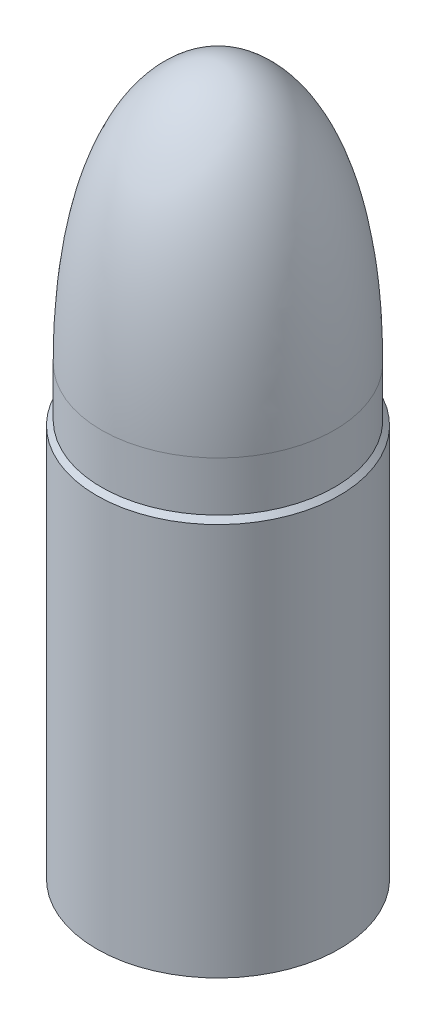
ISO-10303-21;
HEADER;
FILE_DESCRIPTION(('STEP AP214'),'2;1');
FILE_NAME('part.step','',(''),(''),'','','');
FILE_SCHEMA(('AUTOMOTIVE_DESIGN { 1 0 10303 214 1 1 1 1 }'));
ENDSEC;
DATA;
#1=APPLICATION_CONTEXT('core data for automotive mechanical design processes');
#2=APPLICATION_PROTOCOL_DEFINITION('international standard','automotive_design',2000,#1);
#3=PRODUCT_CONTEXT('',#1,'mechanical');
#4=PRODUCT('Part','Part','',(#3));
#5=PRODUCT_RELATED_PRODUCT_CATEGORY('part','',(#4));
#6=PRODUCT_DEFINITION_FORMATION('','',#4);
#7=PRODUCT_DEFINITION_CONTEXT('part definition',#1,'design');
#8=PRODUCT_DEFINITION('design','',#6,#7);
#9=PRODUCT_DEFINITION_SHAPE('','',#8);
#10=(LENGTH_UNIT() NAMED_UNIT(*) SI_UNIT(.MILLI.,.METRE.));
#11=(NAMED_UNIT(*) PLANE_ANGLE_UNIT() SI_UNIT($,.RADIAN.));
#12=(NAMED_UNIT(*) SI_UNIT($,.STERADIAN.) SOLID_ANGLE_UNIT());
#13=UNCERTAINTY_MEASURE_WITH_UNIT(LENGTH_MEASURE(1.E-05),#10,'distance_accuracy_value','');
#14=(GEOMETRIC_REPRESENTATION_CONTEXT(3) GLOBAL_UNCERTAINTY_ASSIGNED_CONTEXT((#13)) GLOBAL_UNIT_ASSIGNED_CONTEXT((#10,
#11,#12)) REPRESENTATION_CONTEXT('',''));
#15=CARTESIAN_POINT('',(0.,0.,0.));
#16=DIRECTION('',(0.,0.,1.));
#17=DIRECTION('',(1.,0.,0.));
#18=AXIS2_PLACEMENT_3D('',#15,#16,#17);
#19=CARTESIAN_POINT('',(0.,5.,0.));
#20=DIRECTION('',(0.,-1.,0.));
#21=DIRECTION('',(0.,0.,-1.));
#22=AXIS2_PLACEMENT_3D('',#19,#20,#21);
#23=CYLINDRICAL_SURFACE('',#22,38.);
#24=CARTESIAN_POINT('',(0.,2.99999999999996,0.));
#25=DIRECTION('',(0.,-1.,0.));
#26=DIRECTION('',(0.,0.,-1.));
#27=AXIS2_PLACEMENT_3D('',#24,#25,#26);
#28=CIRCLE('',#27,38.);
#29=CARTESIAN_POINT('',(0.,2.99999999999996,-38.));
#30=VERTEX_POINT('',#29);
#31=EDGE_CURVE('E51',#30,#30,#28,.T.);
#32=ORIENTED_EDGE('',*,*,#31,.T.);
#33=EDGE_LOOP('',(#32));
#34=FACE_BOUND('',#33,.T.);
#35=CARTESIAN_POINT('',(0.,-120.,0.));
#36=DIRECTION('',(0.,-1.,0.));
#37=DIRECTION('',(0.,0.,-1.));
#38=AXIS2_PLACEMENT_3D('',#35,#36,#37);
#39=CIRCLE('',#38,38.);
#40=CARTESIAN_POINT('',(0.,-120.,-38.));
#41=VERTEX_POINT('',#40);
#42=EDGE_CURVE('E69',#41,#41,#39,.T.);
#43=ORIENTED_EDGE('',*,*,#42,.F.);
#44=EDGE_LOOP('',(#43));
#45=FACE_BOUND('',#44,.T.);
#46=ADVANCED_FACE('F41',(#34,#45),#23,.T.);
#47=CARTESIAN_POINT('',(0.,-120.,0.));
#48=DIRECTION('',(0.,-1.,0.));
#49=DIRECTION('',(0.,0.,-1.));
#50=AXIS2_PLACEMENT_3D('',#47,#48,#49);
#51=PLANE('',#50);
#52=CARTESIAN_POINT('',(0.,-120.,0.));
#53=DIRECTION('',(0.,-1.,0.));
#54=DIRECTION('',(0.,0.,-1.));
#55=AXIS2_PLACEMENT_3D('',#52,#53,#54);
#56=CIRCLE('',#55,37.15);
#57=CARTESIAN_POINT('',(0.,-120.,-37.15));
#58=VERTEX_POINT('',#57);
#59=EDGE_CURVE('E128',#58,#58,#56,.T.);
#60=ORIENTED_EDGE('',*,*,#59,.F.);
#61=EDGE_LOOP('',(#60));
#62=FACE_BOUND('',#61,.T.);
#63=ORIENTED_EDGE('',*,*,#42,.T.);
#64=EDGE_LOOP('',(#63));
#65=FACE_BOUND('',#64,.T.);
#66=ADVANCED_FACE('F106',(#62,#65),#51,.T.);
#67=CARTESIAN_POINT('',(0.,101.5,0.));
#68=CARTESIAN_POINT('',(-0.497779403885969,101.5,0.));
#69=CARTESIAN_POINT('',(-1.48472971578537,101.457926190288,0.));
#70=CARTESIAN_POINT('',(-3.51665078706496,101.201383216473,0.));
#71=CARTESIAN_POINT('',(-6.10420890761229,100.550031186096,0.));
#72=CARTESIAN_POINT('',(-9.25467843592886,99.2167830884273,0.));
#73=CARTESIAN_POINT('',(-13.4542419787965,96.6741236657831,0.));
#74=CARTESIAN_POINT('',(-18.6037196523804,92.0057767303117,0.));
#75=CARTESIAN_POINT('',(-24.3250171432419,83.8228289876688,0.));
#76=CARTESIAN_POINT('',(-28.4724096565303,74.6675651462904,0.));
#77=CARTESIAN_POINT('',(-31.2725777917141,65.8220938187495,0.));
#78=CARTESIAN_POINT('',(-33.0767627567022,58.3965618118162,0.));
#79=CARTESIAN_POINT('',(-34.5476260965655,50.1485429415674,0.));
#80=CARTESIAN_POINT('',(-35.4640970956945,42.5640763779236,0.));
#81=CARTESIAN_POINT('',(-35.9926789826876,36.0535610750085,0.));
#82=CARTESIAN_POINT('',(-36.2820284053247,30.9469083450652,0.));
#83=CARTESIAN_POINT('',(-36.4299143292878,26.4961395330354,0.));
#84=CARTESIAN_POINT('',(-36.4898728145493,22.8288038863717,0.));
#85=CARTESIAN_POINT('',(-36.5,20.9382037538356,0.));
#86=CARTESIAN_POINT('',(-36.5,20.,0.));
#87=B_SPLINE_CURVE_WITH_KNOTS('',3,(#67,#68,#69,#70,#71,#72,#73,#74,#75,#76,#77,#78,#79,#80,#81,
#82,#83,#84,#85,#86),.UNSPECIFIED.,.F.,.F.,(4,1,1,1,1,1,1,1,1,1,1,1,1,1,1,1,1,4),(0.,0.03125,
0.0625,0.125,0.1875,0.25,0.375,0.5,0.625,0.6875,0.75,0.8125,0.875,0.90625,0.9375,0.96875,
0.984375,1.),.UNSPECIFIED.);
#88=CARTESIAN_POINT('',(0.,20.,0.));
#89=DIRECTION('',(0.,-1.,0.));
#90=AXIS1_PLACEMENT('',#88,#89);
#91=SURFACE_OF_REVOLUTION('',#87,#90);
#92=CARTESIAN_POINT('',(0.,20.,0.));
#93=DIRECTION('',(0.,1.,0.));
#94=DIRECTION('',(0.,0.,1.));
#95=AXIS2_PLACEMENT_3D('',#92,#93,#94);
#96=CIRCLE('',#95,36.5);
#97=CARTESIAN_POINT('',(0.,20.,36.5));
#98=VERTEX_POINT('',#97);
#99=EDGE_CURVE('E74',#98,#98,#96,.T.);
#100=ORIENTED_EDGE('',*,*,#99,.T.);
#101=EDGE_LOOP('',(#100));
#102=FACE_BOUND('',#101,.T.);
#103=CARTESIAN_POINT('',(0.,101.5,0.));
#104=VERTEX_POINT('',#103);
#105=VERTEX_LOOP('',#104);
#106=FACE_BOUND('',#105,.T.);
#107=ADVANCED_FACE('F102',(#102,#106),#91,.T.);
#108=CARTESIAN_POINT('',(0.,20.,0.));
#109=DIRECTION('',(0.,-1.,0.));
#110=DIRECTION('',(0.,0.,-1.));
#111=AXIS2_PLACEMENT_3D('',#108,#109,#110);
#112=CYLINDRICAL_SURFACE('',#111,36.5);
#113=CARTESIAN_POINT('',(0.,4.49999999999998,0.));
#114=DIRECTION('',(0.,-1.,0.));
#115=DIRECTION('',(0.,0.,-1.));
#116=AXIS2_PLACEMENT_3D('',#113,#114,#115);
#117=CIRCLE('',#116,36.5);
#118=CARTESIAN_POINT('',(0.,4.49999999999998,-36.5));
#119=VERTEX_POINT('',#118);
#120=EDGE_CURVE('E11',#119,#119,#117,.F.);
#121=ORIENTED_EDGE('',*,*,#120,.T.);
#122=EDGE_LOOP('',(#121));
#123=FACE_BOUND('',#122,.T.);
#124=ORIENTED_EDGE('',*,*,#99,.F.);
#125=EDGE_LOOP('',(#124));
#126=FACE_BOUND('',#125,.T.);
#127=ADVANCED_FACE('F94',(#123,#126),#112,.T.);
#128=CARTESIAN_POINT('',(0.,2.99999999999996,0.));
#129=DIRECTION('',(0.,-1.,0.));
#130=DIRECTION('',(0.,0.,-1.));
#131=AXIS2_PLACEMENT_3D('',#128,#129,#130);
#132=CONICAL_SURFACE('',#131,38.,0.785398163397443);
#133=ORIENTED_EDGE('',*,*,#120,.F.);
#134=EDGE_LOOP('',(#133));
#135=FACE_BOUND('',#134,.T.);
#136=ORIENTED_EDGE('',*,*,#31,.F.);
#137=EDGE_LOOP('',(#136));
#138=FACE_BOUND('',#137,.T.);
#139=ADVANCED_FACE('F44',(#135,#138),#132,.T.);
#140=CARTESIAN_POINT('',(0.,105.076067684321,0.));
#141=DIRECTION('',(0.,-1.,0.));
#142=DIRECTION('',(0.,0.,-1.));
#143=AXIS2_PLACEMENT_3D('',#140,#141,#142);
#144=CYLINDRICAL_SURFACE('',#143,37.15);
#145=ORIENTED_EDGE('',*,*,#59,.T.);
#146=EDGE_LOOP('',(#145));
#147=FACE_BOUND('',#146,.T.);
#148=CARTESIAN_POINT('',(0.,0.,0.));
#149=DIRECTION('',(0.,1.,0.));
#150=DIRECTION('',(0.,0.,1.));
#151=AXIS2_PLACEMENT_3D('',#148,#149,#150);
#152=CIRCLE('',#151,37.15);
#153=CARTESIAN_POINT('',(0.,0.,37.15));
#154=VERTEX_POINT('',#153);
#155=EDGE_CURVE('E77',#154,#154,#152,.F.);
#156=ORIENTED_EDGE('',*,*,#155,.F.);
#157=EDGE_LOOP('',(#156));
#158=FACE_BOUND('',#157,.T.);
#159=ADVANCED_FACE('F61',(#147,#158),#144,.F.);
#160=CARTESIAN_POINT('',(-35.,20.,0.));
#161=CARTESIAN_POINT('',(-35.,80.3322666486309,0.));
#162=CARTESIAN_POINT('',(-14.376326678518,100.,0.));
#163=CARTESIAN_POINT('',(0.,100.,0.));
#164=B_SPLINE_CURVE_WITH_KNOTS('',3,(#160,#161,#162,#163),.UNSPECIFIED.,.F.,.F.,(4,4),(0.,1.),.UNSPECIFIED.);
#165=CARTESIAN_POINT('',(0.,20.,0.));
#166=DIRECTION('',(0.,-1.,0.));
#167=AXIS1_PLACEMENT('',#165,#166);
#168=SURFACE_OF_REVOLUTION('',#164,#167);
#169=CARTESIAN_POINT('',(0.,100.,0.));
#170=VERTEX_POINT('',#169);
#171=VERTEX_LOOP('',#170);
#172=FACE_BOUND('',#171,.T.);
#173=CARTESIAN_POINT('',(0.,20.,0.));
#174=DIRECTION('',(0.,-1.,0.));
#175=DIRECTION('',(0.,0.,-1.));
#176=AXIS2_PLACEMENT_3D('',#173,#174,#175);
#177=CIRCLE('',#176,35.);
#178=CARTESIAN_POINT('',(0.,20.,-35.));
#179=VERTEX_POINT('',#178);
#180=EDGE_CURVE('E65',#179,#179,#177,.T.);
#181=ORIENTED_EDGE('',*,*,#180,.T.);
#182=EDGE_LOOP('',(#181));
#183=FACE_BOUND('',#182,.T.);
#184=ADVANCED_FACE('F57',(#172,#183),#168,.T.);
#185=CARTESIAN_POINT('',(0.,20.,0.));
#186=DIRECTION('',(0.,-1.,0.));
#187=DIRECTION('',(0.,0.,-1.));
#188=AXIS2_PLACEMENT_3D('',#185,#186,#187);
#189=CYLINDRICAL_SURFACE('',#188,35.);
#190=ORIENTED_EDGE('',*,*,#180,.F.);
#191=EDGE_LOOP('',(#190));
#192=FACE_BOUND('',#191,.T.);
#193=CARTESIAN_POINT('',(0.,0.,0.));
#194=DIRECTION('',(0.,1.,0.));
#195=DIRECTION('',(0.,0.,1.));
#196=AXIS2_PLACEMENT_3D('',#193,#194,#195);
#197=CIRCLE('',#196,35.);
#198=CARTESIAN_POINT('',(0.,0.,35.));
#199=VERTEX_POINT('',#198);
#200=EDGE_CURVE('E68',#199,#199,#197,.T.);
#201=ORIENTED_EDGE('',*,*,#200,.F.);
#202=EDGE_LOOP('',(#201));
#203=FACE_BOUND('',#202,.T.);
#204=ADVANCED_FACE('F60',(#192,#203),#189,.F.);
#205=CARTESIAN_POINT('',(0.,0.,0.));
#206=DIRECTION('',(0.,1.,0.));
#207=DIRECTION('',(0.,0.,1.));
#208=AXIS2_PLACEMENT_3D('',#205,#206,#207);
#209=PLANE('',#208);
#210=ORIENTED_EDGE('',*,*,#200,.T.);
#211=EDGE_LOOP('',(#210));
#212=FACE_BOUND('',#211,.T.);
#213=ORIENTED_EDGE('',*,*,#155,.T.);
#214=EDGE_LOOP('',(#213));
#215=FACE_BOUND('',#214,.T.);
#216=ADVANCED_FACE('F137',(#212,#215),#209,.F.);
#217=CLOSED_SHELL('',(#46,#66,#107,#127,#139,#159,#184,#204,#216));
#218=MANIFOLD_SOLID_BREP('B2',#217);
#219=ADVANCED_BREP_SHAPE_REPRESENTATION('',(#18,#218),#14);
#220=SHAPE_DEFINITION_REPRESENTATION(#9,#219);
ENDSEC;
END-ISO-10303-21;
